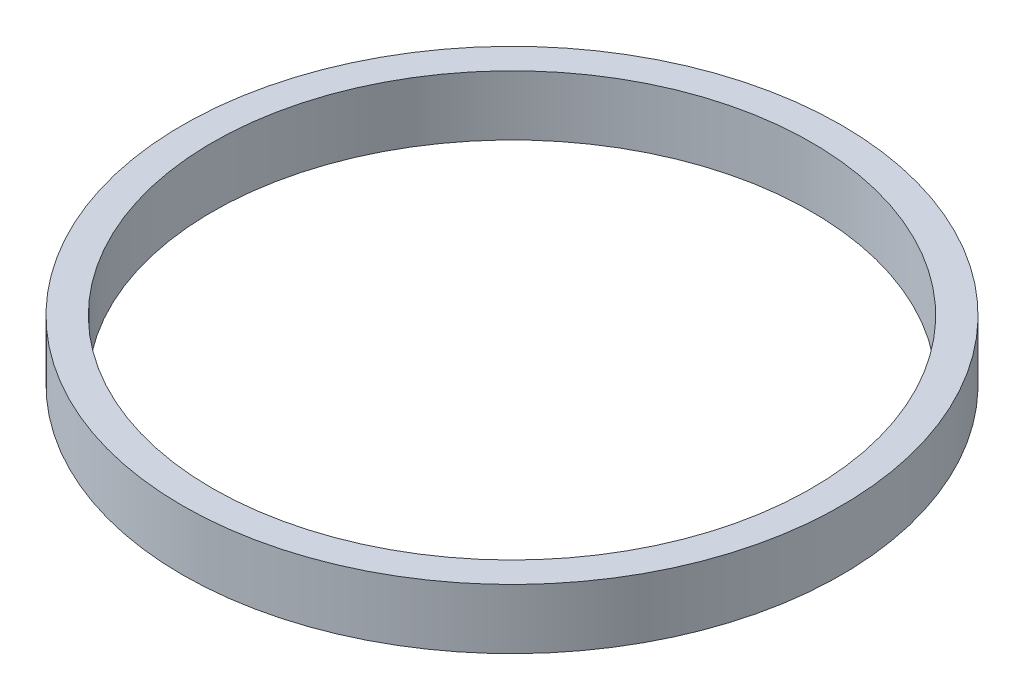
ISO-10303-21;
HEADER;
FILE_DESCRIPTION(('STEP AP214'),'2;1');
FILE_NAME('part.step','',(''),(''),'','','');
FILE_SCHEMA(('AUTOMOTIVE_DESIGN { 1 0 10303 214 1 1 1 1 }'));
ENDSEC;
DATA;
#1=APPLICATION_CONTEXT('core data for automotive mechanical design processes');
#2=APPLICATION_PROTOCOL_DEFINITION('international standard','automotive_design',2000,#1);
#3=PRODUCT_CONTEXT('',#1,'mechanical');
#4=PRODUCT('Part','Part','',(#3));
#5=PRODUCT_RELATED_PRODUCT_CATEGORY('part','',(#4));
#6=PRODUCT_DEFINITION_FORMATION('','',#4);
#7=PRODUCT_DEFINITION_CONTEXT('part definition',#1,'design');
#8=PRODUCT_DEFINITION('design','',#6,#7);
#9=PRODUCT_DEFINITION_SHAPE('','',#8);
#10=(LENGTH_UNIT() NAMED_UNIT(*) SI_UNIT(.MILLI.,.METRE.));
#11=(NAMED_UNIT(*) PLANE_ANGLE_UNIT() SI_UNIT($,.RADIAN.));
#12=(NAMED_UNIT(*) SI_UNIT($,.STERADIAN.) SOLID_ANGLE_UNIT());
#13=UNCERTAINTY_MEASURE_WITH_UNIT(LENGTH_MEASURE(1.E-05),#10,'distance_accuracy_value','');
#14=(GEOMETRIC_REPRESENTATION_CONTEXT(3) GLOBAL_UNCERTAINTY_ASSIGNED_CONTEXT((#13)) GLOBAL_UNIT_ASSIGNED_CONTEXT((#10,
#11,#12)) REPRESENTATION_CONTEXT('',''));
#15=CARTESIAN_POINT('',(0.,0.,0.));
#16=DIRECTION('',(0.,0.,1.));
#17=DIRECTION('',(1.,0.,0.));
#18=AXIS2_PLACEMENT_3D('',#15,#16,#17);
#19=CARTESIAN_POINT('',(0.,3.,0.));
#20=DIRECTION('',(0.,1.,0.));
#21=DIRECTION('',(0.,0.,1.));
#22=AXIS2_PLACEMENT_3D('',#19,#20,#21);
#23=PLANE('',#22);
#24=CARTESIAN_POINT('',(0.,3.,0.));
#25=DIRECTION('',(0.,1.,0.));
#26=DIRECTION('',(0.,0.,1.));
#27=AXIS2_PLACEMENT_3D('',#24,#25,#26);
#28=CIRCLE('',#27,16.5);
#29=CARTESIAN_POINT('',(0.,3.,16.5));
#30=VERTEX_POINT('',#29);
#31=EDGE_CURVE('E10',#30,#30,#28,.T.);
#32=ORIENTED_EDGE('',*,*,#31,.T.);
#33=EDGE_LOOP('',(#32));
#34=FACE_BOUND('',#33,.T.);
#35=CARTESIAN_POINT('',(0.,3.,0.));
#36=DIRECTION('',(0.,1.,0.));
#37=DIRECTION('',(0.,0.,1.));
#38=AXIS2_PLACEMENT_3D('',#35,#36,#37);
#39=CIRCLE('',#38,15.);
#40=CARTESIAN_POINT('',(0.,3.,15.));
#41=VERTEX_POINT('',#40);
#42=EDGE_CURVE('E44',#41,#41,#39,.T.);
#43=ORIENTED_EDGE('',*,*,#42,.F.);
#44=EDGE_LOOP('',(#43));
#45=FACE_BOUND('',#44,.T.);
#46=ADVANCED_FACE('F33',(#34,#45),#23,.T.);
#47=CARTESIAN_POINT('',(0.,0.,0.));
#48=DIRECTION('',(0.,1.,0.));
#49=DIRECTION('',(0.,0.,1.));
#50=AXIS2_PLACEMENT_3D('',#47,#48,#49);
#51=PLANE('',#50);
#52=CARTESIAN_POINT('',(0.,0.,0.));
#53=DIRECTION('',(0.,1.,0.));
#54=DIRECTION('',(0.,0.,1.));
#55=AXIS2_PLACEMENT_3D('',#52,#53,#54);
#56=CIRCLE('',#55,16.5);
#57=CARTESIAN_POINT('',(0.,0.,16.5));
#58=VERTEX_POINT('',#57);
#59=EDGE_CURVE('E37',#58,#58,#56,.T.);
#60=ORIENTED_EDGE('',*,*,#59,.F.);
#61=EDGE_LOOP('',(#60));
#62=FACE_BOUND('',#61,.T.);
#63=CARTESIAN_POINT('',(0.,0.,0.));
#64=DIRECTION('',(0.,1.,0.));
#65=DIRECTION('',(0.,0.,1.));
#66=AXIS2_PLACEMENT_3D('',#63,#64,#65);
#67=CIRCLE('',#66,15.);
#68=CARTESIAN_POINT('',(0.,0.,15.));
#69=VERTEX_POINT('',#68);
#70=EDGE_CURVE('E46',#69,#69,#67,.T.);
#71=ORIENTED_EDGE('',*,*,#70,.T.);
#72=EDGE_LOOP('',(#71));
#73=FACE_BOUND('',#72,.T.);
#74=ADVANCED_FACE('F56',(#62,#73),#51,.F.);
#75=CARTESIAN_POINT('',(0.,3.,0.));
#76=DIRECTION('',(0.,-1.,0.));
#77=DIRECTION('',(0.,0.,-1.));
#78=AXIS2_PLACEMENT_3D('',#75,#76,#77);
#79=CYLINDRICAL_SURFACE('',#78,16.5);
#80=ORIENTED_EDGE('',*,*,#31,.F.);
#81=EDGE_LOOP('',(#80));
#82=FACE_BOUND('',#81,.T.);
#83=ORIENTED_EDGE('',*,*,#59,.T.);
#84=EDGE_LOOP('',(#83));
#85=FACE_BOUND('',#84,.T.);
#86=ADVANCED_FACE('F35',(#82,#85),#79,.T.);
#87=CARTESIAN_POINT('',(0.,3.,0.));
#88=DIRECTION('',(0.,-1.,0.));
#89=DIRECTION('',(0.,0.,-1.));
#90=AXIS2_PLACEMENT_3D('',#87,#88,#89);
#91=CYLINDRICAL_SURFACE('',#90,15.);
#92=ORIENTED_EDGE('',*,*,#42,.T.);
#93=EDGE_LOOP('',(#92));
#94=FACE_BOUND('',#93,.T.);
#95=ORIENTED_EDGE('',*,*,#70,.F.);
#96=EDGE_LOOP('',(#95));
#97=FACE_BOUND('',#96,.T.);
#98=ADVANCED_FACE('F52',(#94,#97),#91,.F.);
#99=CLOSED_SHELL('',(#46,#74,#86,#98));
#100=MANIFOLD_SOLID_BREP('B2',#99);
#101=ADVANCED_BREP_SHAPE_REPRESENTATION('',(#18,#100),#14);
#102=SHAPE_DEFINITION_REPRESENTATION(#9,#101);
ENDSEC;
END-ISO-10303-21;
